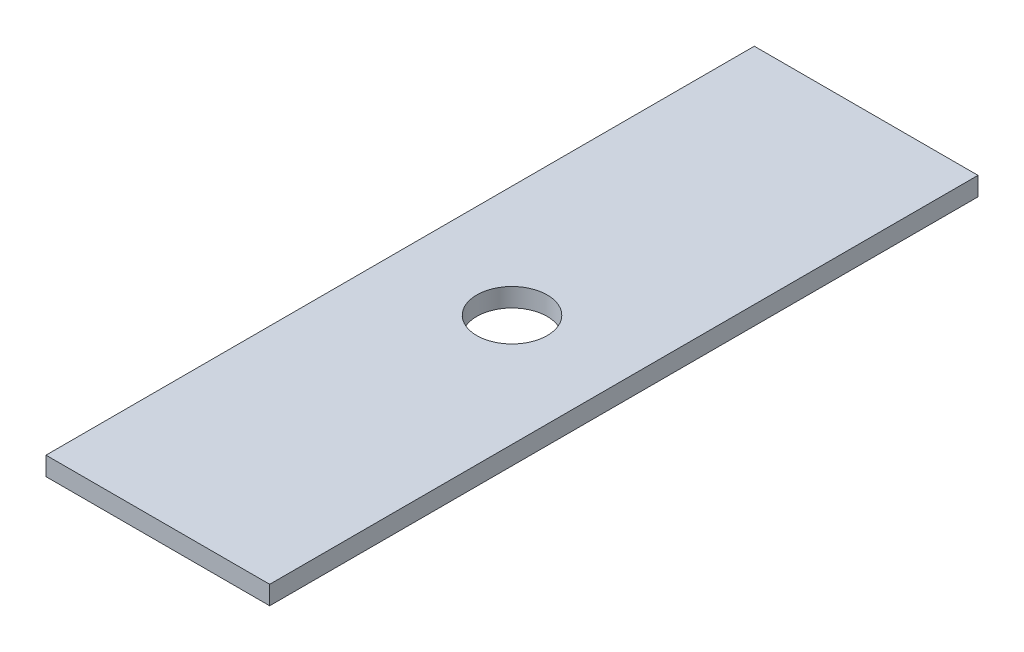
ISO-10303-21;
HEADER;
FILE_DESCRIPTION(('STEP AP214'),'2;1');
FILE_NAME('part.step','',(''),(''),'','','');
FILE_SCHEMA(('AUTOMOTIVE_DESIGN { 1 0 10303 214 1 1 1 1 }'));
ENDSEC;
DATA;
#1=APPLICATION_CONTEXT('core data for automotive mechanical design processes');
#2=APPLICATION_PROTOCOL_DEFINITION('international standard','automotive_design',2000,#1);
#3=PRODUCT_CONTEXT('',#1,'mechanical');
#4=PRODUCT('Part','Part','',(#3));
#5=PRODUCT_RELATED_PRODUCT_CATEGORY('part','',(#4));
#6=PRODUCT_DEFINITION_FORMATION('','',#4);
#7=PRODUCT_DEFINITION_CONTEXT('part definition',#1,'design');
#8=PRODUCT_DEFINITION('design','',#6,#7);
#9=PRODUCT_DEFINITION_SHAPE('','',#8);
#10=(LENGTH_UNIT() NAMED_UNIT(*) SI_UNIT(.MILLI.,.METRE.));
#11=(NAMED_UNIT(*) PLANE_ANGLE_UNIT() SI_UNIT($,.RADIAN.));
#12=(NAMED_UNIT(*) SI_UNIT($,.STERADIAN.) SOLID_ANGLE_UNIT());
#13=UNCERTAINTY_MEASURE_WITH_UNIT(LENGTH_MEASURE(1.E-05),#10,'distance_accuracy_value','');
#14=(GEOMETRIC_REPRESENTATION_CONTEXT(3) GLOBAL_UNCERTAINTY_ASSIGNED_CONTEXT((#13)) GLOBAL_UNIT_ASSIGNED_CONTEXT((#10,
#11,#12)) REPRESENTATION_CONTEXT('',''));
#15=CARTESIAN_POINT('',(0.,0.,0.));
#16=DIRECTION('',(0.,0.,1.));
#17=DIRECTION('',(1.,0.,0.));
#18=AXIS2_PLACEMENT_3D('',#15,#16,#17);
#19=CARTESIAN_POINT('',(-19.05,1.5875,60.325));
#20=DIRECTION('',(1.,0.,0.));
#21=DIRECTION('',(0.,0.,-1.));
#22=AXIS2_PLACEMENT_3D('',#19,#20,#21);
#23=PLANE('',#22);
#24=DIRECTION('',(0.,0.,-1.));
#25=VECTOR('',#24,1.);
#26=CARTESIAN_POINT('',(-19.05,1.5875,60.325));
#27=LINE('',#26,#25);
#28=CARTESIAN_POINT('',(-19.05,1.5875,60.325));
#29=VERTEX_POINT('',#28);
#30=CARTESIAN_POINT('',(-19.05,1.5875,-60.325));
#31=VERTEX_POINT('',#30);
#32=EDGE_CURVE('E93',#29,#31,#27,.T.);
#33=ORIENTED_EDGE('',*,*,#32,.T.);
#34=DIRECTION('',(0.,-1.,0.));
#35=VECTOR('',#34,1.);
#36=CARTESIAN_POINT('',(-19.05,1.5875,-60.325));
#37=LINE('',#36,#35);
#38=CARTESIAN_POINT('',(-19.05,-1.5875,-60.325));
#39=VERTEX_POINT('',#38);
#40=EDGE_CURVE('E88',#31,#39,#37,.T.);
#41=ORIENTED_EDGE('',*,*,#40,.T.);
#42=DIRECTION('',(0.,0.,-1.));
#43=VECTOR('',#42,1.);
#44=CARTESIAN_POINT('',(-19.05,-1.5875,60.325));
#45=LINE('',#44,#43);
#46=CARTESIAN_POINT('',(-19.05,-1.5875,60.325));
#47=VERTEX_POINT('',#46);
#48=EDGE_CURVE('E11',#47,#39,#45,.T.);
#49=ORIENTED_EDGE('',*,*,#48,.F.);
#50=DIRECTION('',(0.,-1.,0.));
#51=VECTOR('',#50,1.);
#52=CARTESIAN_POINT('',(-19.05,1.5875,60.325));
#53=LINE('',#52,#51);
#54=EDGE_CURVE('E104',#29,#47,#53,.T.);
#55=ORIENTED_EDGE('',*,*,#54,.F.);
#56=EDGE_LOOP('',(#33,#41,#49,#55));
#57=FACE_BOUND('',#56,.T.);
#58=ADVANCED_FACE('F36',(#57),#23,.F.);
#59=CARTESIAN_POINT('',(19.05,-1.5875,60.325));
#60=DIRECTION('',(0.,1.,0.));
#61=DIRECTION('',(0.,0.,1.));
#62=AXIS2_PLACEMENT_3D('',#59,#60,#61);
#63=PLANE('',#62);
#64=CARTESIAN_POINT('',(0.,-1.5875,0.));
#65=DIRECTION('',(0.,1.,0.));
#66=DIRECTION('',(0.,0.,1.));
#67=AXIS2_PLACEMENT_3D('',#64,#65,#66);
#68=CIRCLE('',#67,6.);
#69=CARTESIAN_POINT('',(0.,-1.5875,6.));
#70=VERTEX_POINT('',#69);
#71=EDGE_CURVE('E94',#70,#70,#68,.T.);
#72=ORIENTED_EDGE('',*,*,#71,.T.);
#73=EDGE_LOOP('',(#72));
#74=FACE_BOUND('',#73,.T.);
#75=ORIENTED_EDGE('',*,*,#48,.T.);
#76=DIRECTION('',(1.,0.,0.));
#77=VECTOR('',#76,1.);
#78=CARTESIAN_POINT('',(19.05,-1.5875,-60.325));
#79=LINE('',#78,#77);
#80=CARTESIAN_POINT('',(19.05,-1.5875,-60.325));
#81=VERTEX_POINT('',#80);
#82=EDGE_CURVE('E78',#39,#81,#79,.T.);
#83=ORIENTED_EDGE('',*,*,#82,.T.);
#84=DIRECTION('',(0.,0.,-1.));
#85=VECTOR('',#84,1.);
#86=CARTESIAN_POINT('',(19.05,-1.5875,60.325));
#87=LINE('',#86,#85);
#88=CARTESIAN_POINT('',(19.05,-1.5875,60.325));
#89=VERTEX_POINT('',#88);
#90=EDGE_CURVE('E43',#89,#81,#87,.T.);
#91=ORIENTED_EDGE('',*,*,#90,.F.);
#92=DIRECTION('',(1.,0.,0.));
#93=VECTOR('',#92,1.);
#94=CARTESIAN_POINT('',(19.05,-1.5875,60.325));
#95=LINE('',#94,#93);
#96=EDGE_CURVE('E79',#47,#89,#95,.T.);
#97=ORIENTED_EDGE('',*,*,#96,.F.);
#98=EDGE_LOOP('',(#75,#83,#91,#97));
#99=FACE_BOUND('',#98,.T.);
#100=ADVANCED_FACE('F76',(#74,#99),#63,.F.);
#101=CARTESIAN_POINT('',(19.05,1.5875,60.325));
#102=DIRECTION('',(-1.,0.,0.));
#103=DIRECTION('',(0.,0.,1.));
#104=AXIS2_PLACEMENT_3D('',#101,#102,#103);
#105=PLANE('',#104);
#106=ORIENTED_EDGE('',*,*,#90,.T.);
#107=DIRECTION('',(0.,1.,0.));
#108=VECTOR('',#107,1.);
#109=CARTESIAN_POINT('',(19.05,1.5875,-60.325));
#110=LINE('',#109,#108);
#111=CARTESIAN_POINT('',(19.05,1.5875,-60.325));
#112=VERTEX_POINT('',#111);
#113=EDGE_CURVE('E91',#81,#112,#110,.T.);
#114=ORIENTED_EDGE('',*,*,#113,.T.);
#115=DIRECTION('',(0.,0.,-1.));
#116=VECTOR('',#115,1.);
#117=CARTESIAN_POINT('',(19.05,1.5875,60.325));
#118=LINE('',#117,#116);
#119=CARTESIAN_POINT('',(19.05,1.5875,60.325));
#120=VERTEX_POINT('',#119);
#121=EDGE_CURVE('E110',#120,#112,#118,.T.);
#122=ORIENTED_EDGE('',*,*,#121,.F.);
#123=DIRECTION('',(0.,1.,0.));
#124=VECTOR('',#123,1.);
#125=CARTESIAN_POINT('',(19.05,1.5875,60.325));
#126=LINE('',#125,#124);
#127=EDGE_CURVE('E55',#89,#120,#126,.T.);
#128=ORIENTED_EDGE('',*,*,#127,.F.);
#129=EDGE_LOOP('',(#106,#114,#122,#128));
#130=FACE_BOUND('',#129,.T.);
#131=ADVANCED_FACE('F112',(#130),#105,.F.);
#132=CARTESIAN_POINT('',(19.05,1.5875,60.325));
#133=DIRECTION('',(0.,-1.,0.));
#134=DIRECTION('',(0.,0.,-1.));
#135=AXIS2_PLACEMENT_3D('',#132,#133,#134);
#136=PLANE('',#135);
#137=CARTESIAN_POINT('',(0.,1.5875,0.));
#138=DIRECTION('',(0.,1.,0.));
#139=DIRECTION('',(0.,0.,1.));
#140=AXIS2_PLACEMENT_3D('',#137,#138,#139);
#141=CIRCLE('',#140,6.);
#142=CARTESIAN_POINT('',(0.,1.5875,6.));
#143=VERTEX_POINT('',#142);
#144=EDGE_CURVE('E97',#143,#143,#141,.T.);
#145=ORIENTED_EDGE('',*,*,#144,.F.);
#146=EDGE_LOOP('',(#145));
#147=FACE_BOUND('',#146,.T.);
#148=ORIENTED_EDGE('',*,*,#121,.T.);
#149=DIRECTION('',(-1.,0.,0.));
#150=VECTOR('',#149,1.);
#151=CARTESIAN_POINT('',(19.05,1.5875,-60.325));
#152=LINE('',#151,#150);
#153=EDGE_CURVE('E102',#112,#31,#152,.T.);
#154=ORIENTED_EDGE('',*,*,#153,.T.);
#155=ORIENTED_EDGE('',*,*,#32,.F.);
#156=DIRECTION('',(-1.,0.,0.));
#157=VECTOR('',#156,1.);
#158=CARTESIAN_POINT('',(19.05,1.5875,60.325));
#159=LINE('',#158,#157);
#160=EDGE_CURVE('E50',#120,#29,#159,.T.);
#161=ORIENTED_EDGE('',*,*,#160,.F.);
#162=EDGE_LOOP('',(#148,#154,#155,#161));
#163=FACE_BOUND('',#162,.T.);
#164=ADVANCED_FACE('F114',(#147,#163),#136,.F.);
#165=CARTESIAN_POINT('',(0.,0.,60.325));
#166=DIRECTION('',(0.,0.,-1.));
#167=DIRECTION('',(-1.,0.,0.));
#168=AXIS2_PLACEMENT_3D('',#165,#166,#167);
#169=PLANE('',#168);
#170=ORIENTED_EDGE('',*,*,#54,.T.);
#171=ORIENTED_EDGE('',*,*,#96,.T.);
#172=ORIENTED_EDGE('',*,*,#127,.T.);
#173=ORIENTED_EDGE('',*,*,#160,.T.);
#174=EDGE_LOOP('',(#170,#171,#172,#173));
#175=FACE_BOUND('',#174,.T.);
#176=ADVANCED_FACE('F115',(#175),#169,.F.);
#177=CARTESIAN_POINT('',(0.,0.,-60.325));
#178=DIRECTION('',(0.,0.,-1.));
#179=DIRECTION('',(-1.,0.,0.));
#180=AXIS2_PLACEMENT_3D('',#177,#178,#179);
#181=PLANE('',#180);
#182=ORIENTED_EDGE('',*,*,#40,.F.);
#183=ORIENTED_EDGE('',*,*,#153,.F.);
#184=ORIENTED_EDGE('',*,*,#113,.F.);
#185=ORIENTED_EDGE('',*,*,#82,.F.);
#186=EDGE_LOOP('',(#182,#183,#184,#185));
#187=FACE_BOUND('',#186,.T.);
#188=ADVANCED_FACE('F86',(#187),#181,.T.);
#189=CARTESIAN_POINT('',(0.,1.5875,0.));
#190=DIRECTION('',(0.,1.,0.));
#191=DIRECTION('',(0.,0.,1.));
#192=AXIS2_PLACEMENT_3D('',#189,#190,#191);
#193=CYLINDRICAL_SURFACE('',#192,6.);
#194=ORIENTED_EDGE('',*,*,#144,.T.);
#195=EDGE_LOOP('',(#194));
#196=FACE_BOUND('',#195,.T.);
#197=ORIENTED_EDGE('',*,*,#71,.F.);
#198=EDGE_LOOP('',(#197));
#199=FACE_BOUND('',#198,.T.);
#200=ADVANCED_FACE('F122',(#196,#199),#193,.F.);
#201=CLOSED_SHELL('',(#58,#100,#131,#164,#176,#188,#200));
#202=MANIFOLD_SOLID_BREP('B2',#201);
#203=ADVANCED_BREP_SHAPE_REPRESENTATION('',(#18,#202),#14);
#204=SHAPE_DEFINITION_REPRESENTATION(#9,#203);
ENDSEC;
END-ISO-10303-21;
